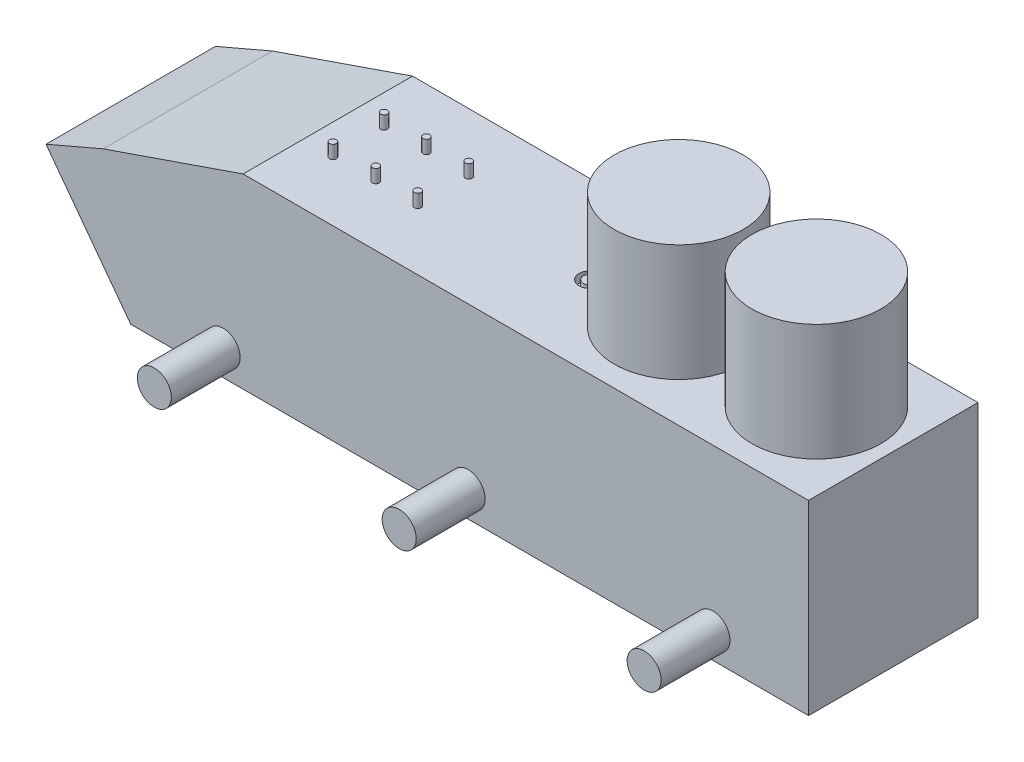
ISO-10303-21;
HEADER;
FILE_DESCRIPTION(('STEP AP214'),'2;1');
FILE_NAME('part.step','',(''),(''),'','','');
FILE_SCHEMA(('AUTOMOTIVE_DESIGN { 1 0 10303 214 1 1 1 1 }'));
ENDSEC;
DATA;
#1=APPLICATION_CONTEXT('core data for automotive mechanical design processes');
#2=APPLICATION_PROTOCOL_DEFINITION('international standard','automotive_design',2000,#1);
#3=PRODUCT_CONTEXT('',#1,'mechanical');
#4=PRODUCT('Part','Part','',(#3));
#5=PRODUCT_RELATED_PRODUCT_CATEGORY('part','',(#4));
#6=PRODUCT_DEFINITION_FORMATION('','',#4);
#7=PRODUCT_DEFINITION_CONTEXT('part definition',#1,'design');
#8=PRODUCT_DEFINITION('design','',#6,#7);
#9=PRODUCT_DEFINITION_SHAPE('','',#8);
#10=(LENGTH_UNIT() NAMED_UNIT(*) SI_UNIT(.MILLI.,.METRE.));
#11=(NAMED_UNIT(*) PLANE_ANGLE_UNIT() SI_UNIT($,.RADIAN.));
#12=(NAMED_UNIT(*) SI_UNIT($,.STERADIAN.) SOLID_ANGLE_UNIT());
#13=UNCERTAINTY_MEASURE_WITH_UNIT(LENGTH_MEASURE(1.E-05),#10,'distance_accuracy_value','');
#14=(GEOMETRIC_REPRESENTATION_CONTEXT(3) GLOBAL_UNCERTAINTY_ASSIGNED_CONTEXT((#13)) GLOBAL_UNIT_ASSIGNED_CONTEXT((#10,
#11,#12)) REPRESENTATION_CONTEXT('',''));
#15=CARTESIAN_POINT('',(0.,0.,0.));
#16=DIRECTION('',(0.,0.,1.));
#17=DIRECTION('',(1.,0.,0.));
#18=AXIS2_PLACEMENT_3D('',#15,#16,#17);
#19=CARTESIAN_POINT('',(1650.,290.827338129496,500.));
#20=DIRECTION('',(0.,-1.,0.));
#21=DIRECTION('',(1.,0.,0.));
#22=AXIS2_PLACEMENT_3D('',#19,#20,#21);
#23=PLANE('',#22);
#24=CARTESIAN_POINT('',(763.220602861019,290.827338129496,258.53961209144));
#25=DIRECTION('',(0.,1.,0.));
#26=DIRECTION('',(-1.,0.,0.));
#27=AXIS2_PLACEMENT_3D('',#24,#25,#26);
#28=CIRCLE('',#27,31.7499999999999);
#29=CARTESIAN_POINT('',(731.470602861019,290.827338129496,258.53961209144));
#30=VERTEX_POINT('',#29);
#31=EDGE_CURVE('E359',#30,#30,#28,.T.);
#32=ORIENTED_EDGE('',*,*,#31,.F.);
#33=EDGE_LOOP('',(#32));
#34=FACE_BOUND('',#33,.T.);
#35=CARTESIAN_POINT('',(1421.4,290.827338129496,248.149283126668));
#36=DIRECTION('',(0.,-1.,0.));
#37=DIRECTION('',(1.,0.,0.));
#38=AXIS2_PLACEMENT_3D('',#35,#36,#37);
#39=CIRCLE('',#38,190.5);
#40=CARTESIAN_POINT('',(1421.4,290.827338129496,57.6492831266675));
#41=VERTEX_POINT('',#40);
#42=EDGE_CURVE('E11',#41,#41,#39,.F.);
#43=ORIENTED_EDGE('',*,*,#42,.F.);
#44=EDGE_LOOP('',(#43));
#45=FACE_BOUND('',#44,.T.);
#46=CARTESIAN_POINT('',(1015.,290.827338129496,248.149283126668));
#47=DIRECTION('',(0.,-1.,0.));
#48=DIRECTION('',(1.,0.,0.));
#49=AXIS2_PLACEMENT_3D('',#46,#47,#48);
#50=CIRCLE('',#49,190.5);
#51=CARTESIAN_POINT('',(1015.,290.827338129496,57.6492831266678));
#52=VERTEX_POINT('',#51);
#53=EDGE_CURVE('E42',#52,#52,#50,.F.);
#54=ORIENTED_EDGE('',*,*,#53,.F.);
#55=EDGE_LOOP('',(#54));
#56=FACE_BOUND('',#55,.T.);
#57=CARTESIAN_POINT('',(70.5935735585222,290.827338129496,323.788946961614));
#58=DIRECTION('',(0.,-1.,0.));
#59=DIRECTION('',(1.,0.,0.));
#60=AXIS2_PLACEMENT_3D('',#57,#58,#59);
#61=CIRCLE('',#60,10.);
#62=CARTESIAN_POINT('',(80.5935735585222,290.827338129496,323.788946961614));
#63=VERTEX_POINT('',#62);
#64=EDGE_CURVE('E158',#63,#63,#61,.T.);
#65=ORIENTED_EDGE('',*,*,#64,.T.);
#66=EDGE_LOOP('',(#65));
#67=FACE_BOUND('',#66,.T.);
#68=CARTESIAN_POINT('',(195.593573558522,290.827338129496,322.32623375142));
#69=DIRECTION('',(0.,-1.,0.));
#70=DIRECTION('',(1.,0.,0.));
#71=AXIS2_PLACEMENT_3D('',#68,#69,#70);
#72=CIRCLE('',#71,10.);
#73=CARTESIAN_POINT('',(205.593573558522,290.827338129496,322.32623375142));
#74=VERTEX_POINT('',#73);
#75=EDGE_CURVE('E154',#74,#74,#72,.F.);
#76=ORIENTED_EDGE('',*,*,#75,.F.);
#77=EDGE_LOOP('',(#76));
#78=FACE_BOUND('',#77,.T.);
#79=CARTESIAN_POINT('',(320.593573558522,290.827338129496,323.788946961614));
#80=DIRECTION('',(0.,-1.,0.));
#81=DIRECTION('',(1.,0.,0.));
#82=AXIS2_PLACEMENT_3D('',#79,#80,#81);
#83=CIRCLE('',#82,9.99999999999998);
#84=CARTESIAN_POINT('',(330.593573558522,290.827338129496,323.788946961614));
#85=VERTEX_POINT('',#84);
#86=EDGE_CURVE('E143',#85,#85,#83,.F.);
#87=ORIENTED_EDGE('',*,*,#86,.F.);
#88=EDGE_LOOP('',(#87));
#89=FACE_BOUND('',#88,.T.);
#90=CARTESIAN_POINT('',(320.593573558522,290.827338129496,173.12555336084));
#91=DIRECTION('',(0.,-1.,0.));
#92=DIRECTION('',(1.,0.,0.));
#93=AXIS2_PLACEMENT_3D('',#90,#91,#92);
#94=CIRCLE('',#93,9.99999999999998);
#95=CARTESIAN_POINT('',(330.593573558522,290.827338129496,173.12555336084));
#96=VERTEX_POINT('',#95);
#97=EDGE_CURVE('E148',#96,#96,#94,.T.);
#98=ORIENTED_EDGE('',*,*,#97,.T.);
#99=EDGE_LOOP('',(#98));
#100=FACE_BOUND('',#99,.T.);
#101=CARTESIAN_POINT('',(195.593573558522,290.827338129496,173.12555336084));
#102=DIRECTION('',(0.,-1.,0.));
#103=DIRECTION('',(1.,0.,0.));
#104=AXIS2_PLACEMENT_3D('',#101,#102,#103);
#105=CIRCLE('',#104,10.);
#106=CARTESIAN_POINT('',(205.593573558522,290.827338129496,173.12555336084));
#107=VERTEX_POINT('',#106);
#108=EDGE_CURVE('E144',#107,#107,#105,.T.);
#109=ORIENTED_EDGE('',*,*,#108,.T.);
#110=EDGE_LOOP('',(#109));
#111=FACE_BOUND('',#110,.T.);
#112=CARTESIAN_POINT('',(70.5935735585222,290.827338129496,173.12555336084));
#113=DIRECTION('',(0.,-1.,0.));
#114=DIRECTION('',(1.,0.,0.));
#115=AXIS2_PLACEMENT_3D('',#112,#113,#114);
#116=CIRCLE('',#115,10.);
#117=CARTESIAN_POINT('',(80.5935735585222,290.827338129496,173.12555336084));
#118=VERTEX_POINT('',#117);
#119=EDGE_CURVE('E140',#118,#118,#116,.F.);
#120=ORIENTED_EDGE('',*,*,#119,.F.);
#121=EDGE_LOOP('',(#120));
#122=FACE_BOUND('',#121,.T.);
#123=DIRECTION('',(0.,0.,-1.));
#124=VECTOR('',#123,1.);
#125=CARTESIAN_POINT('',(-18.4803499003083,290.827338129496,500.));
#126=LINE('',#125,#124);
#127=CARTESIAN_POINT('',(-18.4803499003079,290.827338129496,500.));
#128=VERTEX_POINT('',#127);
#129=CARTESIAN_POINT('',(-18.4803499003062,290.827338129497,0.));
#130=VERTEX_POINT('',#129);
#131=EDGE_CURVE('E49',#128,#130,#126,.T.);
#132=ORIENTED_EDGE('',*,*,#131,.F.);
#133=DIRECTION('',(-1.,0.,0.));
#134=VECTOR('',#133,1.);
#135=CARTESIAN_POINT('',(1650.,290.827338129496,500.));
#136=LINE('',#135,#134);
#137=CARTESIAN_POINT('',(1650.,290.827338129496,500.));
#138=VERTEX_POINT('',#137);
#139=EDGE_CURVE('E86',#138,#128,#136,.T.);
#140=ORIENTED_EDGE('',*,*,#139,.F.);
#141=DIRECTION('',(0.,0.,-1.));
#142=VECTOR('',#141,1.);
#143=CARTESIAN_POINT('',(1650.,290.827338129496,500.));
#144=LINE('',#143,#142);
#145=CARTESIAN_POINT('',(1650.,290.827338129496,0.));
#146=VERTEX_POINT('',#145);
#147=EDGE_CURVE('E137',#138,#146,#144,.T.);
#148=ORIENTED_EDGE('',*,*,#147,.T.);
#149=DIRECTION('',(-1.,0.,0.));
#150=VECTOR('',#149,1.);
#151=CARTESIAN_POINT('',(1650.,290.827338129496,0.));
#152=LINE('',#151,#150);
#153=EDGE_CURVE('E125',#146,#130,#152,.T.);
#154=ORIENTED_EDGE('',*,*,#153,.T.);
#155=EDGE_LOOP('',(#132,#140,#148,#154));
#156=FACE_BOUND('',#155,.T.);
#157=ADVANCED_FACE('F34',(#34,#45,#56,#67,#78,#89,#100,#111,#122,#156),#23,.F.);
#158=CARTESIAN_POINT('',(-600.,76.0791366906475,500.));
#159=DIRECTION('',(0.394637197892977,-0.918837026919997,0.));
#160=DIRECTION('',(0.918837026919997,0.394637197892977,0.));
#161=AXIS2_PLACEMENT_3D('',#158,#159,#160);
#162=PLANE('',#161);
#163=DIRECTION('',(0.,0.,1.));
#164=VECTOR('',#163,1.);
#165=CARTESIAN_POINT('',(-431.441514428658,148.474399918051,500.));
#166=LINE('',#165,#164);
#167=CARTESIAN_POINT('',(-431.44151442866,148.47439991805,0.));
#168=VERTEX_POINT('',#167);
#169=CARTESIAN_POINT('',(-431.44151442866,148.47439991805,500.));
#170=VERTEX_POINT('',#169);
#171=EDGE_CURVE('E95',#168,#170,#166,.T.);
#172=ORIENTED_EDGE('',*,*,#171,.F.);
#173=DIRECTION('',(-0.918837026919997,-0.394637197892977,0.));
#174=VECTOR('',#173,1.);
#175=CARTESIAN_POINT('',(-600.,76.0791366906475,0.));
#176=LINE('',#175,#174);
#177=CARTESIAN_POINT('',(-600.,76.0791366906475,0.));
#178=VERTEX_POINT('',#177);
#179=EDGE_CURVE('E128',#168,#178,#176,.T.);
#180=ORIENTED_EDGE('',*,*,#179,.T.);
#181=DIRECTION('',(0.,0.,-1.));
#182=VECTOR('',#181,1.);
#183=CARTESIAN_POINT('',(-600.,76.0791366906475,500.));
#184=LINE('',#183,#182);
#185=CARTESIAN_POINT('',(-600.,76.0791366906475,500.));
#186=VERTEX_POINT('',#185);
#187=EDGE_CURVE('E111',#186,#178,#184,.T.);
#188=ORIENTED_EDGE('',*,*,#187,.F.);
#189=DIRECTION('',(-0.918837026919997,-0.394637197892977,0.));
#190=VECTOR('',#189,1.);
#191=CARTESIAN_POINT('',(-600.,76.0791366906475,500.));
#192=LINE('',#191,#190);
#193=EDGE_CURVE('E105',#170,#186,#192,.T.);
#194=ORIENTED_EDGE('',*,*,#193,.F.);
#195=EDGE_LOOP('',(#172,#180,#188,#194));
#196=FACE_BOUND('',#195,.T.);
#197=ADVANCED_FACE('F109',(#196),#162,.F.);
#198=CARTESIAN_POINT('',(0.,0.,500.));
#199=DIRECTION('',(0.,0.,1.));
#200=DIRECTION('',(1.,0.,0.));
#201=AXIS2_PLACEMENT_3D('',#198,#199,#200);
#202=PLANE('',#201);
#203=CARTESIAN_POINT('',(645.43,-182.972661870504,500.));
#204=DIRECTION('',(0.,0.,1.));
#205=DIRECTION('',(1.,0.,0.));
#206=AXIS2_PLACEMENT_3D('',#203,#204,#205);
#207=CIRCLE('',#206,50.292);
#208=CARTESIAN_POINT('',(695.722,-182.972661870504,500.));
#209=VERTEX_POINT('',#208);
#210=EDGE_CURVE('E376',#209,#209,#207,.T.);
#211=ORIENTED_EDGE('',*,*,#210,.F.);
#212=EDGE_LOOP('',(#211));
#213=FACE_BOUND('',#212,.T.);
#214=CARTESIAN_POINT('',(-77.2000000000002,-182.972661870504,500.));
#215=DIRECTION('',(0.,0.,1.));
#216=DIRECTION('',(1.,0.,0.));
#217=AXIS2_PLACEMENT_3D('',#214,#215,#216);
#218=CIRCLE('',#217,50.165);
#219=CARTESIAN_POINT('',(-27.0350000000002,-182.972661870504,500.));
#220=VERTEX_POINT('',#219);
#221=EDGE_CURVE('E380',#220,#220,#218,.T.);
#222=ORIENTED_EDGE('',*,*,#221,.F.);
#223=EDGE_LOOP('',(#222));
#224=FACE_BOUND('',#223,.T.);
#225=CARTESIAN_POINT('',(1368.06,-182.972661870504,500.));
#226=DIRECTION('',(0.,0.,1.));
#227=DIRECTION('',(1.,0.,0.));
#228=AXIS2_PLACEMENT_3D('',#225,#226,#227);
#229=CIRCLE('',#228,50.165);
#230=CARTESIAN_POINT('',(1418.225,-182.972661870504,500.));
#231=VERTEX_POINT('',#230);
#232=EDGE_CURVE('E386',#231,#231,#229,.T.);
#233=ORIENTED_EDGE('',*,*,#232,.F.);
#234=EDGE_LOOP('',(#233));
#235=FACE_BOUND('',#234,.T.);
#236=ORIENTED_EDGE('',*,*,#139,.T.);
#237=DIRECTION('',(0.945406463628837,0.32589356932719,0.));
#238=VECTOR('',#237,1.);
#239=CARTESIAN_POINT('',(-629.160159727757,80.318281340511,500.));
#240=LINE('',#239,#238);
#241=EDGE_CURVE('E98',#170,#128,#240,.T.);
#242=ORIENTED_EDGE('',*,*,#241,.F.);
#243=ORIENTED_EDGE('',*,*,#193,.T.);
#244=DIRECTION('',(0.597795774435643,-0.801648434207222,0.));
#245=VECTOR('',#244,1.);
#246=CARTESIAN_POINT('',(-600.,76.0791366906475,500.));
#247=LINE('',#246,#245);
#248=CARTESIAN_POINT('',(-350.,-259.172661870504,500.));
#249=VERTEX_POINT('',#248);
#250=EDGE_CURVE('E113',#186,#249,#247,.T.);
#251=ORIENTED_EDGE('',*,*,#250,.T.);
#252=DIRECTION('',(1.,0.,0.));
#253=VECTOR('',#252,1.);
#254=CARTESIAN_POINT('',(1650.,-259.172661870504,500.));
#255=LINE('',#254,#253);
#256=CARTESIAN_POINT('',(1650.,-259.172661870504,500.));
#257=VERTEX_POINT('',#256);
#258=EDGE_CURVE('E58',#249,#257,#255,.T.);
#259=ORIENTED_EDGE('',*,*,#258,.T.);
#260=DIRECTION('',(0.,1.,0.));
#261=VECTOR('',#260,1.);
#262=CARTESIAN_POINT('',(1650.,-259.172661870504,500.));
#263=LINE('',#262,#261);
#264=EDGE_CURVE('E116',#257,#138,#263,.T.);
#265=ORIENTED_EDGE('',*,*,#264,.T.);
#266=EDGE_LOOP('',(#236,#242,#243,#251,#259,#265));
#267=FACE_BOUND('',#266,.T.);
#268=ADVANCED_FACE('F104',(#213,#224,#235,#267),#202,.T.);
#269=CARTESIAN_POINT('',(0.,0.,0.));
#270=DIRECTION('',(0.,0.,1.));
#271=DIRECTION('',(1.,0.,0.));
#272=AXIS2_PLACEMENT_3D('',#269,#270,#271);
#273=PLANE('',#272);
#274=CARTESIAN_POINT('',(622.57,-182.972661870504,0.));
#275=DIRECTION('',(0.,0.,1.));
#276=DIRECTION('',(1.,0.,0.));
#277=AXIS2_PLACEMENT_3D('',#274,#275,#276);
#278=CIRCLE('',#277,50.1650000000001);
#279=CARTESIAN_POINT('',(672.735,-182.972661870504,0.));
#280=VERTEX_POINT('',#279);
#281=EDGE_CURVE('E168',#280,#280,#278,.F.);
#282=ORIENTED_EDGE('',*,*,#281,.F.);
#283=EDGE_LOOP('',(#282));
#284=FACE_BOUND('',#283,.T.);
#285=CARTESIAN_POINT('',(-77.1999999999999,-182.972661870504,0.));
#286=DIRECTION('',(0.,0.,1.));
#287=DIRECTION('',(1.,0.,0.));
#288=AXIS2_PLACEMENT_3D('',#285,#286,#287);
#289=CIRCLE('',#288,50.1649999999999);
#290=CARTESIAN_POINT('',(-27.035,-182.972661870504,0.));
#291=VERTEX_POINT('',#290);
#292=EDGE_CURVE('E165',#291,#291,#289,.F.);
#293=ORIENTED_EDGE('',*,*,#292,.F.);
#294=EDGE_LOOP('',(#293));
#295=FACE_BOUND('',#294,.T.);
#296=CARTESIAN_POINT('',(1345.2,-182.972661870504,0.));
#297=DIRECTION('',(0.,0.,1.));
#298=DIRECTION('',(1.,0.,0.));
#299=AXIS2_PLACEMENT_3D('',#296,#297,#298);
#300=CIRCLE('',#299,50.165);
#301=CARTESIAN_POINT('',(1395.365,-182.972661870504,0.));
#302=VERTEX_POINT('',#301);
#303=EDGE_CURVE('E157',#302,#302,#300,.F.);
#304=ORIENTED_EDGE('',*,*,#303,.F.);
#305=EDGE_LOOP('',(#304));
#306=FACE_BOUND('',#305,.T.);
#307=DIRECTION('',(-0.945406463628837,-0.32589356932719,0.));
#308=VECTOR('',#307,1.);
#309=CARTESIAN_POINT('',(-91.5671871110701,265.633380645828,0.));
#310=LINE('',#309,#308);
#311=EDGE_CURVE('E99',#130,#168,#310,.T.);
#312=ORIENTED_EDGE('',*,*,#311,.F.);
#313=ORIENTED_EDGE('',*,*,#153,.F.);
#314=DIRECTION('',(0.,1.,0.));
#315=VECTOR('',#314,1.);
#316=CARTESIAN_POINT('',(1650.,-259.172661870504,0.));
#317=LINE('',#316,#315);
#318=CARTESIAN_POINT('',(1650.,-259.172661870504,0.));
#319=VERTEX_POINT('',#318);
#320=EDGE_CURVE('E122',#319,#146,#317,.T.);
#321=ORIENTED_EDGE('',*,*,#320,.F.);
#322=DIRECTION('',(1.,0.,0.));
#323=VECTOR('',#322,1.);
#324=CARTESIAN_POINT('',(1650.,-259.172661870504,0.));
#325=LINE('',#324,#323);
#326=CARTESIAN_POINT('',(-350.,-259.172661870504,0.));
#327=VERTEX_POINT('',#326);
#328=EDGE_CURVE('E79',#327,#319,#325,.T.);
#329=ORIENTED_EDGE('',*,*,#328,.F.);
#330=DIRECTION('',(0.597795774435643,-0.801648434207222,0.));
#331=VECTOR('',#330,1.);
#332=CARTESIAN_POINT('',(-600.,76.0791366906475,0.));
#333=LINE('',#332,#331);
#334=EDGE_CURVE('E130',#178,#327,#333,.T.);
#335=ORIENTED_EDGE('',*,*,#334,.F.);
#336=ORIENTED_EDGE('',*,*,#179,.F.);
#337=EDGE_LOOP('',(#312,#313,#321,#329,#335,#336));
#338=FACE_BOUND('',#337,.T.);
#339=ADVANCED_FACE('F196',(#284,#295,#306,#338),#273,.F.);
#340=CARTESIAN_POINT('',(1650.,-259.172661870504,500.));
#341=DIRECTION('',(-1.,0.,0.));
#342=DIRECTION('',(0.,0.,1.));
#343=AXIS2_PLACEMENT_3D('',#340,#341,#342);
#344=PLANE('',#343);
#345=ORIENTED_EDGE('',*,*,#320,.T.);
#346=ORIENTED_EDGE('',*,*,#147,.F.);
#347=ORIENTED_EDGE('',*,*,#264,.F.);
#348=DIRECTION('',(0.,0.,-1.));
#349=VECTOR('',#348,1.);
#350=CARTESIAN_POINT('',(1650.,-259.172661870504,500.));
#351=LINE('',#350,#349);
#352=EDGE_CURVE('E121',#257,#319,#351,.T.);
#353=ORIENTED_EDGE('',*,*,#352,.T.);
#354=EDGE_LOOP('',(#345,#346,#347,#353));
#355=FACE_BOUND('',#354,.T.);
#356=ADVANCED_FACE('F36',(#355),#344,.F.);
#357=CARTESIAN_POINT('',(-600.,76.0791366906475,500.));
#358=DIRECTION('',(0.801648434207222,0.597795774435643,0.));
#359=DIRECTION('',(-0.597795774435643,0.801648434207222,0.));
#360=AXIS2_PLACEMENT_3D('',#357,#358,#359);
#361=PLANE('',#360);
#362=ORIENTED_EDGE('',*,*,#334,.T.);
#363=DIRECTION('',(0.,0.,-1.));
#364=VECTOR('',#363,1.);
#365=CARTESIAN_POINT('',(-350.,-259.172661870504,500.));
#366=LINE('',#365,#364);
#367=EDGE_CURVE('E134',#249,#327,#366,.T.);
#368=ORIENTED_EDGE('',*,*,#367,.F.);
#369=ORIENTED_EDGE('',*,*,#250,.F.);
#370=ORIENTED_EDGE('',*,*,#187,.T.);
#371=EDGE_LOOP('',(#362,#368,#369,#370));
#372=FACE_BOUND('',#371,.T.);
#373=ADVANCED_FACE('F199',(#372),#361,.F.);
#374=CARTESIAN_POINT('',(1650.,-259.172661870504,500.));
#375=DIRECTION('',(0.,1.,0.));
#376=DIRECTION('',(-1.,0.,0.));
#377=AXIS2_PLACEMENT_3D('',#374,#375,#376);
#378=PLANE('',#377);
#379=ORIENTED_EDGE('',*,*,#328,.T.);
#380=ORIENTED_EDGE('',*,*,#352,.F.);
#381=ORIENTED_EDGE('',*,*,#258,.F.);
#382=ORIENTED_EDGE('',*,*,#367,.T.);
#383=EDGE_LOOP('',(#379,#380,#381,#382));
#384=FACE_BOUND('',#383,.T.);
#385=ADVANCED_FACE('F201',(#384),#378,.F.);
#386=CARTESIAN_POINT('',(-629.160159727757,80.318281340511,500.));
#387=DIRECTION('',(-0.32589356932719,0.945406463628837,0.));
#388=DIRECTION('',(-0.945406463628837,-0.32589356932719,0.));
#389=AXIS2_PLACEMENT_3D('',#386,#387,#388);
#390=PLANE('',#389);
#391=ORIENTED_EDGE('',*,*,#131,.T.);
#392=ORIENTED_EDGE('',*,*,#311,.T.);
#393=ORIENTED_EDGE('',*,*,#171,.T.);
#394=ORIENTED_EDGE('',*,*,#241,.T.);
#395=EDGE_LOOP('',(#391,#392,#393,#394));
#396=FACE_BOUND('',#395,.T.);
#397=ADVANCED_FACE('F97',(#396),#390,.T.);
#398=CARTESIAN_POINT('',(70.5935735585222,330.,173.12555336084));
#399=DIRECTION('',(0.,-1.,0.));
#400=DIRECTION('',(0.,0.,-1.));
#401=AXIS2_PLACEMENT_3D('',#398,#399,#400);
#402=CYLINDRICAL_SURFACE('',#401,10.);
#403=CARTESIAN_POINT('',(70.5935735585222,330.,173.12555336084));
#404=DIRECTION('',(0.,1.,0.));
#405=DIRECTION('',(0.,0.,1.));
#406=AXIS2_PLACEMENT_3D('',#403,#404,#405);
#407=CIRCLE('',#406,10.);
#408=CARTESIAN_POINT('',(70.5935735585222,330.,183.12555336084));
#409=VERTEX_POINT('',#408);
#410=EDGE_CURVE('E107',#409,#409,#407,.T.);
#411=ORIENTED_EDGE('',*,*,#410,.F.);
#412=EDGE_LOOP('',(#411));
#413=FACE_BOUND('',#412,.T.);
#414=ORIENTED_EDGE('',*,*,#119,.T.);
#415=EDGE_LOOP('',(#414));
#416=FACE_BOUND('',#415,.T.);
#417=ADVANCED_FACE('F208',(#413,#416),#402,.T.);
#418=CARTESIAN_POINT('',(70.5935735585222,330.,173.12555336084));
#419=DIRECTION('',(0.,1.,0.));
#420=DIRECTION('',(0.,0.,1.));
#421=AXIS2_PLACEMENT_3D('',#418,#419,#420);
#422=PLANE('',#421);
#423=ORIENTED_EDGE('',*,*,#410,.T.);
#424=EDGE_LOOP('',(#423));
#425=FACE_BOUND('',#424,.T.);
#426=ADVANCED_FACE('F228',(#425),#422,.T.);
#427=CARTESIAN_POINT('',(195.593573558522,330.,173.12555336084));
#428=DIRECTION('',(0.,-1.,0.));
#429=DIRECTION('',(0.,0.,-1.));
#430=AXIS2_PLACEMENT_3D('',#427,#428,#429);
#431=CYLINDRICAL_SURFACE('',#430,10.);
#432=CARTESIAN_POINT('',(195.593573558522,330.,173.12555336084));
#433=DIRECTION('',(0.,-1.,0.));
#434=DIRECTION('',(0.,0.,-1.));
#435=AXIS2_PLACEMENT_3D('',#432,#433,#434);
#436=CIRCLE('',#435,10.);
#437=CARTESIAN_POINT('',(195.593573558522,330.,163.12555336084));
#438=VERTEX_POINT('',#437);
#439=EDGE_CURVE('E147',#438,#438,#436,.T.);
#440=ORIENTED_EDGE('',*,*,#439,.T.);
#441=EDGE_LOOP('',(#440));
#442=FACE_BOUND('',#441,.T.);
#443=ORIENTED_EDGE('',*,*,#108,.F.);
#444=EDGE_LOOP('',(#443));
#445=FACE_BOUND('',#444,.T.);
#446=ADVANCED_FACE('F232',(#442,#445),#431,.T.);
#447=CARTESIAN_POINT('',(195.593573558522,330.,173.12555336084));
#448=DIRECTION('',(0.,-1.,0.));
#449=DIRECTION('',(0.,0.,-1.));
#450=AXIS2_PLACEMENT_3D('',#447,#448,#449);
#451=PLANE('',#450);
#452=ORIENTED_EDGE('',*,*,#439,.F.);
#453=EDGE_LOOP('',(#452));
#454=FACE_BOUND('',#453,.T.);
#455=ADVANCED_FACE('F234',(#454),#451,.F.);
#456=CARTESIAN_POINT('',(320.593573558522,330.,173.12555336084));
#457=DIRECTION('',(0.,-1.,0.));
#458=DIRECTION('',(0.,0.,-1.));
#459=AXIS2_PLACEMENT_3D('',#456,#457,#458);
#460=CYLINDRICAL_SURFACE('',#459,9.99999999999998);
#461=CARTESIAN_POINT('',(320.593573558522,330.,173.12555336084));
#462=DIRECTION('',(0.,-1.,0.));
#463=DIRECTION('',(0.,0.,-1.));
#464=AXIS2_PLACEMENT_3D('',#461,#462,#463);
#465=CIRCLE('',#464,9.99999999999998);
#466=CARTESIAN_POINT('',(320.593573558522,330.,163.12555336084));
#467=VERTEX_POINT('',#466);
#468=EDGE_CURVE('E151',#467,#467,#465,.T.);
#469=ORIENTED_EDGE('',*,*,#468,.T.);
#470=EDGE_LOOP('',(#469));
#471=FACE_BOUND('',#470,.T.);
#472=ORIENTED_EDGE('',*,*,#97,.F.);
#473=EDGE_LOOP('',(#472));
#474=FACE_BOUND('',#473,.T.);
#475=ADVANCED_FACE('F237',(#471,#474),#460,.T.);
#476=CARTESIAN_POINT('',(320.593573558522,330.,173.12555336084));
#477=DIRECTION('',(0.,-1.,0.));
#478=DIRECTION('',(0.,0.,-1.));
#479=AXIS2_PLACEMENT_3D('',#476,#477,#478);
#480=PLANE('',#479);
#481=ORIENTED_EDGE('',*,*,#468,.F.);
#482=EDGE_LOOP('',(#481));
#483=FACE_BOUND('',#482,.T.);
#484=ADVANCED_FACE('F242',(#483),#480,.F.);
#485=CARTESIAN_POINT('',(320.593573558522,330.,323.788946961614));
#486=DIRECTION('',(0.,-1.,0.));
#487=DIRECTION('',(0.,0.,-1.));
#488=AXIS2_PLACEMENT_3D('',#485,#486,#487);
#489=CYLINDRICAL_SURFACE('',#488,9.99999999999998);
#490=CARTESIAN_POINT('',(320.593573558522,330.,323.788946961614));
#491=DIRECTION('',(0.,1.,0.));
#492=DIRECTION('',(0.,0.,1.));
#493=AXIS2_PLACEMENT_3D('',#490,#491,#492);
#494=CIRCLE('',#493,9.99999999999998);
#495=CARTESIAN_POINT('',(320.593573558522,330.,333.788946961614));
#496=VERTEX_POINT('',#495);
#497=EDGE_CURVE('E404',#496,#496,#494,.T.);
#498=ORIENTED_EDGE('',*,*,#497,.F.);
#499=EDGE_LOOP('',(#498));
#500=FACE_BOUND('',#499,.T.);
#501=ORIENTED_EDGE('',*,*,#86,.T.);
#502=EDGE_LOOP('',(#501));
#503=FACE_BOUND('',#502,.T.);
#504=ADVANCED_FACE('F245',(#500,#503),#489,.T.);
#505=CARTESIAN_POINT('',(320.593573558522,330.,323.788946961614));
#506=DIRECTION('',(0.,1.,0.));
#507=DIRECTION('',(0.,0.,1.));
#508=AXIS2_PLACEMENT_3D('',#505,#506,#507);
#509=PLANE('',#508);
#510=ORIENTED_EDGE('',*,*,#497,.T.);
#511=EDGE_LOOP('',(#510));
#512=FACE_BOUND('',#511,.T.);
#513=ADVANCED_FACE('F250',(#512),#509,.T.);
#514=CARTESIAN_POINT('',(195.593573558522,330.,322.32623375142));
#515=DIRECTION('',(0.,-1.,0.));
#516=DIRECTION('',(0.,0.,-1.));
#517=AXIS2_PLACEMENT_3D('',#514,#515,#516);
#518=CYLINDRICAL_SURFACE('',#517,10.);
#519=CARTESIAN_POINT('',(195.593573558522,330.,322.32623375142));
#520=DIRECTION('',(0.,1.,0.));
#521=DIRECTION('',(0.,0.,1.));
#522=AXIS2_PLACEMENT_3D('',#519,#520,#521);
#523=CIRCLE('',#522,10.);
#524=CARTESIAN_POINT('',(195.593573558522,330.,332.32623375142));
#525=VERTEX_POINT('',#524);
#526=EDGE_CURVE('E161',#525,#525,#523,.T.);
#527=ORIENTED_EDGE('',*,*,#526,.F.);
#528=EDGE_LOOP('',(#527));
#529=FACE_BOUND('',#528,.T.);
#530=ORIENTED_EDGE('',*,*,#75,.T.);
#531=EDGE_LOOP('',(#530));
#532=FACE_BOUND('',#531,.T.);
#533=ADVANCED_FACE('F253',(#529,#532),#518,.T.);
#534=CARTESIAN_POINT('',(195.593573558522,330.,322.32623375142));
#535=DIRECTION('',(0.,1.,0.));
#536=DIRECTION('',(0.,0.,1.));
#537=AXIS2_PLACEMENT_3D('',#534,#535,#536);
#538=PLANE('',#537);
#539=ORIENTED_EDGE('',*,*,#526,.T.);
#540=EDGE_LOOP('',(#539));
#541=FACE_BOUND('',#540,.T.);
#542=ADVANCED_FACE('F258',(#541),#538,.T.);
#543=CARTESIAN_POINT('',(70.5935735585222,330.,323.788946961614));
#544=DIRECTION('',(0.,-1.,0.));
#545=DIRECTION('',(0.,0.,-1.));
#546=AXIS2_PLACEMENT_3D('',#543,#544,#545);
#547=CYLINDRICAL_SURFACE('',#546,10.);
#548=CARTESIAN_POINT('',(70.5935735585222,330.,323.788946961614));
#549=DIRECTION('',(0.,-1.,0.));
#550=DIRECTION('',(0.,0.,-1.));
#551=AXIS2_PLACEMENT_3D('',#548,#549,#550);
#552=CIRCLE('',#551,10.);
#553=CARTESIAN_POINT('',(70.5935735585222,330.,313.788946961614));
#554=VERTEX_POINT('',#553);
#555=EDGE_CURVE('E162',#554,#554,#552,.T.);
#556=ORIENTED_EDGE('',*,*,#555,.T.);
#557=EDGE_LOOP('',(#556));
#558=FACE_BOUND('',#557,.T.);
#559=ORIENTED_EDGE('',*,*,#64,.F.);
#560=EDGE_LOOP('',(#559));
#561=FACE_BOUND('',#560,.T.);
#562=ADVANCED_FACE('F261',(#558,#561),#547,.T.);
#563=CARTESIAN_POINT('',(70.5935735585222,330.,323.788946961614));
#564=DIRECTION('',(0.,-1.,0.));
#565=DIRECTION('',(0.,0.,-1.));
#566=AXIS2_PLACEMENT_3D('',#563,#564,#565);
#567=PLANE('',#566);
#568=ORIENTED_EDGE('',*,*,#555,.F.);
#569=EDGE_LOOP('',(#568));
#570=FACE_BOUND('',#569,.T.);
#571=ADVANCED_FACE('F266',(#570),#567,.F.);
#572=CARTESIAN_POINT('',(1345.2,-182.972661870504,-203.2));
#573=DIRECTION('',(0.,0.,1.));
#574=DIRECTION('',(1.,0.,0.));
#575=AXIS2_PLACEMENT_3D('',#572,#573,#574);
#576=CYLINDRICAL_SURFACE('',#575,50.165);
#577=CARTESIAN_POINT('',(1345.2,-182.972661870504,-203.2));
#578=DIRECTION('',(0.,0.,-1.));
#579=DIRECTION('',(-1.,0.,0.));
#580=AXIS2_PLACEMENT_3D('',#577,#578,#579);
#581=CIRCLE('',#580,50.165);
#582=CARTESIAN_POINT('',(1295.035,-182.972661870504,-203.2));
#583=VERTEX_POINT('',#582);
#584=EDGE_CURVE('E397',#583,#583,#581,.T.);
#585=ORIENTED_EDGE('',*,*,#584,.F.);
#586=EDGE_LOOP('',(#585));
#587=FACE_BOUND('',#586,.T.);
#588=ORIENTED_EDGE('',*,*,#303,.T.);
#589=EDGE_LOOP('',(#588));
#590=FACE_BOUND('',#589,.T.);
#591=ADVANCED_FACE('F269',(#587,#590),#576,.T.);
#592=CARTESIAN_POINT('',(1345.2,-182.972661870504,-203.2));
#593=DIRECTION('',(0.,0.,-1.));
#594=DIRECTION('',(-1.,0.,0.));
#595=AXIS2_PLACEMENT_3D('',#592,#593,#594);
#596=PLANE('',#595);
#597=ORIENTED_EDGE('',*,*,#584,.T.);
#598=EDGE_LOOP('',(#597));
#599=FACE_BOUND('',#598,.T.);
#600=ADVANCED_FACE('F276',(#599),#596,.T.);
#601=CARTESIAN_POINT('',(-77.1999999999999,-182.972661870504,-203.2));
#602=DIRECTION('',(0.,0.,1.));
#603=DIRECTION('',(1.,0.,0.));
#604=AXIS2_PLACEMENT_3D('',#601,#602,#603);
#605=CYLINDRICAL_SURFACE('',#604,50.1649999999999);
#606=CARTESIAN_POINT('',(-77.1999999999999,-182.972661870504,-203.2));
#607=DIRECTION('',(0.,0.,-1.));
#608=DIRECTION('',(-1.,0.,0.));
#609=AXIS2_PLACEMENT_3D('',#606,#607,#608);
#610=CIRCLE('',#609,50.1649999999999);
#611=CARTESIAN_POINT('',(-127.365,-182.972661870504,-203.2));
#612=VERTEX_POINT('',#611);
#613=EDGE_CURVE('E392',#612,#612,#610,.T.);
#614=ORIENTED_EDGE('',*,*,#613,.F.);
#615=EDGE_LOOP('',(#614));
#616=FACE_BOUND('',#615,.T.);
#617=ORIENTED_EDGE('',*,*,#292,.T.);
#618=EDGE_LOOP('',(#617));
#619=FACE_BOUND('',#618,.T.);
#620=ADVANCED_FACE('F280',(#616,#619),#605,.T.);
#621=CARTESIAN_POINT('',(-77.1999999999999,-182.972661870504,-203.2));
#622=DIRECTION('',(0.,0.,-1.));
#623=DIRECTION('',(-1.,0.,0.));
#624=AXIS2_PLACEMENT_3D('',#621,#622,#623);
#625=PLANE('',#624);
#626=ORIENTED_EDGE('',*,*,#613,.T.);
#627=EDGE_LOOP('',(#626));
#628=FACE_BOUND('',#627,.T.);
#629=ADVANCED_FACE('F284',(#628),#625,.T.);
#630=CARTESIAN_POINT('',(1368.06,-182.972661870504,703.2));
#631=DIRECTION('',(0.,0.,-1.));
#632=DIRECTION('',(-1.,0.,0.));
#633=AXIS2_PLACEMENT_3D('',#630,#631,#632);
#634=CYLINDRICAL_SURFACE('',#633,50.165);
#635=CARTESIAN_POINT('',(1368.06,-182.972661870504,703.2));
#636=DIRECTION('',(0.,0.,1.));
#637=DIRECTION('',(1.,0.,0.));
#638=AXIS2_PLACEMENT_3D('',#635,#636,#637);
#639=CIRCLE('',#638,50.165);
#640=CARTESIAN_POINT('',(1418.225,-182.972661870504,703.2));
#641=VERTEX_POINT('',#640);
#642=EDGE_CURVE('E389',#641,#641,#639,.T.);
#643=ORIENTED_EDGE('',*,*,#642,.F.);
#644=EDGE_LOOP('',(#643));
#645=FACE_BOUND('',#644,.T.);
#646=ORIENTED_EDGE('',*,*,#232,.T.);
#647=EDGE_LOOP('',(#646));
#648=FACE_BOUND('',#647,.T.);
#649=ADVANCED_FACE('F288',(#645,#648),#634,.T.);
#650=CARTESIAN_POINT('',(1368.06,-182.972661870504,703.2));
#651=DIRECTION('',(0.,0.,1.));
#652=DIRECTION('',(1.,0.,0.));
#653=AXIS2_PLACEMENT_3D('',#650,#651,#652);
#654=PLANE('',#653);
#655=ORIENTED_EDGE('',*,*,#642,.T.);
#656=EDGE_LOOP('',(#655));
#657=FACE_BOUND('',#656,.T.);
#658=ADVANCED_FACE('F292',(#657),#654,.T.);
#659=CARTESIAN_POINT('',(-77.2000000000002,-182.972661870504,703.2));
#660=DIRECTION('',(0.,0.,-1.));
#661=DIRECTION('',(-1.,0.,0.));
#662=AXIS2_PLACEMENT_3D('',#659,#660,#661);
#663=CYLINDRICAL_SURFACE('',#662,50.165);
#664=CARTESIAN_POINT('',(-77.2000000000002,-182.972661870504,703.2));
#665=DIRECTION('',(0.,0.,1.));
#666=DIRECTION('',(1.,0.,0.));
#667=AXIS2_PLACEMENT_3D('',#664,#665,#666);
#668=CIRCLE('',#667,50.165);
#669=CARTESIAN_POINT('',(-27.0350000000002,-182.972661870504,703.2));
#670=VERTEX_POINT('',#669);
#671=EDGE_CURVE('E383',#670,#670,#668,.T.);
#672=ORIENTED_EDGE('',*,*,#671,.F.);
#673=EDGE_LOOP('',(#672));
#674=FACE_BOUND('',#673,.T.);
#675=ORIENTED_EDGE('',*,*,#221,.T.);
#676=EDGE_LOOP('',(#675));
#677=FACE_BOUND('',#676,.T.);
#678=ADVANCED_FACE('F296',(#674,#677),#663,.T.);
#679=CARTESIAN_POINT('',(-77.2000000000002,-182.972661870504,703.2));
#680=DIRECTION('',(0.,0.,1.));
#681=DIRECTION('',(1.,0.,0.));
#682=AXIS2_PLACEMENT_3D('',#679,#680,#681);
#683=PLANE('',#682);
#684=ORIENTED_EDGE('',*,*,#671,.T.);
#685=EDGE_LOOP('',(#684));
#686=FACE_BOUND('',#685,.T.);
#687=ADVANCED_FACE('F300',(#686),#683,.T.);
#688=CARTESIAN_POINT('',(645.43,-182.972661870504,703.2));
#689=DIRECTION('',(0.,0.,-1.));
#690=DIRECTION('',(-1.,0.,0.));
#691=AXIS2_PLACEMENT_3D('',#688,#689,#690);
#692=CYLINDRICAL_SURFACE('',#691,50.292);
#693=CARTESIAN_POINT('',(645.43,-182.972661870504,703.2));
#694=DIRECTION('',(0.,0.,1.));
#695=DIRECTION('',(1.,0.,0.));
#696=AXIS2_PLACEMENT_3D('',#693,#694,#695);
#697=CIRCLE('',#696,50.292);
#698=CARTESIAN_POINT('',(695.722,-182.972661870504,703.2));
#699=VERTEX_POINT('',#698);
#700=EDGE_CURVE('E377',#699,#699,#697,.T.);
#701=ORIENTED_EDGE('',*,*,#700,.F.);
#702=EDGE_LOOP('',(#701));
#703=FACE_BOUND('',#702,.T.);
#704=ORIENTED_EDGE('',*,*,#210,.T.);
#705=EDGE_LOOP('',(#704));
#706=FACE_BOUND('',#705,.T.);
#707=ADVANCED_FACE('F304',(#703,#706),#692,.T.);
#708=CARTESIAN_POINT('',(645.43,-182.972661870504,703.2));
#709=DIRECTION('',(0.,0.,1.));
#710=DIRECTION('',(1.,0.,0.));
#711=AXIS2_PLACEMENT_3D('',#708,#709,#710);
#712=PLANE('',#711);
#713=ORIENTED_EDGE('',*,*,#700,.T.);
#714=EDGE_LOOP('',(#713));
#715=FACE_BOUND('',#714,.T.);
#716=ADVANCED_FACE('F308',(#715),#712,.T.);
#717=CARTESIAN_POINT('',(622.57,-182.972661870504,-203.2));
#718=DIRECTION('',(0.,0.,1.));
#719=DIRECTION('',(1.,0.,0.));
#720=AXIS2_PLACEMENT_3D('',#717,#718,#719);
#721=CYLINDRICAL_SURFACE('',#720,50.1650000000001);
#722=CARTESIAN_POINT('',(622.57,-182.972661870504,-203.2));
#723=DIRECTION('',(0.,0.,-1.));
#724=DIRECTION('',(-1.,0.,0.));
#725=AXIS2_PLACEMENT_3D('',#722,#723,#724);
#726=CIRCLE('',#725,50.1650000000001);
#727=CARTESIAN_POINT('',(572.405,-182.972661870504,-203.2));
#728=VERTEX_POINT('',#727);
#729=EDGE_CURVE('E373',#728,#728,#726,.T.);
#730=ORIENTED_EDGE('',*,*,#729,.F.);
#731=EDGE_LOOP('',(#730));
#732=FACE_BOUND('',#731,.T.);
#733=ORIENTED_EDGE('',*,*,#281,.T.);
#734=EDGE_LOOP('',(#733));
#735=FACE_BOUND('',#734,.T.);
#736=ADVANCED_FACE('F312',(#732,#735),#721,.T.);
#737=CARTESIAN_POINT('',(622.57,-182.972661870504,-203.2));
#738=DIRECTION('',(0.,0.,-1.));
#739=DIRECTION('',(-1.,0.,0.));
#740=AXIS2_PLACEMENT_3D('',#737,#738,#739);
#741=PLANE('',#740);
#742=ORIENTED_EDGE('',*,*,#729,.T.);
#743=EDGE_LOOP('',(#742));
#744=FACE_BOUND('',#743,.T.);
#745=ADVANCED_FACE('F316',(#744),#741,.T.);
#746=CARTESIAN_POINT('',(1015.,635.,248.149283126668));
#747=DIRECTION('',(0.,-1.,0.));
#748=DIRECTION('',(0.,0.,-1.));
#749=AXIS2_PLACEMENT_3D('',#746,#747,#748);
#750=CYLINDRICAL_SURFACE('',#749,190.5);
#751=CARTESIAN_POINT('',(1015.,635.,248.149283126668));
#752=DIRECTION('',(0.,1.,0.));
#753=DIRECTION('',(0.,0.,1.));
#754=AXIS2_PLACEMENT_3D('',#751,#752,#753);
#755=CIRCLE('',#754,190.5);
#756=CARTESIAN_POINT('',(1015.,635.,57.6492831266678));
#757=VERTEX_POINT('',#756);
#758=EDGE_CURVE('E370',#757,#757,#755,.T.);
#759=CARTESIAN_POINT('',(1015.,635.,57.6492831266678));
#760=CARTESIAN_POINT('',(1015.,631.414868105516,57.6492831266678));
#761=CARTESIAN_POINT('',(1015.,627.829736211031,57.6492831266678));
#762=CARTESIAN_POINT('',(1015.,620.659472422062,57.6492831266678));
#763=CARTESIAN_POINT('',(1015.,617.074340527578,57.6492831266678));
#764=CARTESIAN_POINT('',(1015.,609.904076738609,57.6492831266678));
#765=CARTESIAN_POINT('',(1015.,606.318944844125,57.6492831266678));
#766=CARTESIAN_POINT('',(1015.,599.148681055156,57.6492831266678));
#767=CARTESIAN_POINT('',(1015.,595.563549160671,57.6492831266678));
#768=CARTESIAN_POINT('',(1015.,588.393285371703,57.6492831266678));
#769=CARTESIAN_POINT('',(1015.,584.808153477218,57.6492831266678));
#770=CARTESIAN_POINT('',(1015.,577.637889688249,57.6492831266678));
#771=CARTESIAN_POINT('',(1015.,574.052757793765,57.6492831266678));
#772=CARTESIAN_POINT('',(1015.,566.882494004796,57.6492831266678));
#773=CARTESIAN_POINT('',(1015.,563.297362110312,57.6492831266678));
#774=CARTESIAN_POINT('',(1015.,556.127098321343,57.6492831266678));
#775=CARTESIAN_POINT('',(1015.,552.541966426858,57.6492831266678));
#776=CARTESIAN_POINT('',(1015.,545.37170263789,57.6492831266678));
#777=CARTESIAN_POINT('',(1015.,541.786570743405,57.6492831266678));
#778=CARTESIAN_POINT('',(1015.,534.616306954436,57.6492831266678));
#779=CARTESIAN_POINT('',(1015.,531.031175059952,57.6492831266678));
#780=CARTESIAN_POINT('',(1015.,523.860911270983,57.6492831266678));
#781=CARTESIAN_POINT('',(1015.,520.275779376499,57.6492831266678));
#782=CARTESIAN_POINT('',(1015.,513.10551558753,57.6492831266678));
#783=CARTESIAN_POINT('',(1015.,509.520383693046,57.6492831266678));
#784=CARTESIAN_POINT('',(1015.,502.350119904077,57.6492831266678));
#785=CARTESIAN_POINT('',(1015.,498.764988009592,57.6492831266678));
#786=CARTESIAN_POINT('',(1015.,491.594724220624,57.6492831266678));
#787=CARTESIAN_POINT('',(1015.,488.009592326139,57.6492831266678));
#788=CARTESIAN_POINT('',(1015.,480.83932853717,57.6492831266678));
#789=CARTESIAN_POINT('',(1015.,477.254196642686,57.6492831266678));
#790=CARTESIAN_POINT('',(1015.,470.083932853717,57.6492831266678));
#791=CARTESIAN_POINT('',(1015.,466.498800959233,57.6492831266678));
#792=CARTESIAN_POINT('',(1015.,459.328537170264,57.6492831266678));
#793=CARTESIAN_POINT('',(1015.,455.743405275779,57.6492831266678));
#794=CARTESIAN_POINT('',(1015.,448.573141486811,57.6492831266678));
#795=CARTESIAN_POINT('',(1015.,444.988009592326,57.6492831266678));
#796=CARTESIAN_POINT('',(1015.,437.817745803357,57.6492831266678));
#797=CARTESIAN_POINT('',(1015.,434.232613908873,57.6492831266678));
#798=CARTESIAN_POINT('',(1015.,427.062350119904,57.6492831266678));
#799=CARTESIAN_POINT('',(1015.,423.47721822542,57.6492831266678));
#800=CARTESIAN_POINT('',(1015.,416.306954436451,57.6492831266678));
#801=CARTESIAN_POINT('',(1015.,412.721822541966,57.6492831266678));
#802=CARTESIAN_POINT('',(1015.,405.551558752998,57.6492831266678));
#803=CARTESIAN_POINT('',(1015.,401.966426858513,57.6492831266678));
#804=CARTESIAN_POINT('',(1015.,394.796163069544,57.6492831266678));
#805=CARTESIAN_POINT('',(1015.,391.21103117506,57.6492831266678));
#806=CARTESIAN_POINT('',(1015.,384.040767386091,57.6492831266678));
#807=CARTESIAN_POINT('',(1015.,380.455635491607,57.6492831266678));
#808=CARTESIAN_POINT('',(1015.,373.285371702638,57.6492831266678));
#809=CARTESIAN_POINT('',(1015.,369.700239808153,57.6492831266678));
#810=CARTESIAN_POINT('',(1015.,362.529976019185,57.6492831266678));
#811=CARTESIAN_POINT('',(1015.,358.9448441247,57.6492831266678));
#812=CARTESIAN_POINT('',(1015.,351.774580335731,57.6492831266678));
#813=CARTESIAN_POINT('',(1015.,348.189448441247,57.6492831266678));
#814=CARTESIAN_POINT('',(1015.,341.019184652278,57.6492831266678));
#815=CARTESIAN_POINT('',(1015.,337.434052757794,57.6492831266678));
#816=CARTESIAN_POINT('',(1015.,330.263788968825,57.6492831266678));
#817=CARTESIAN_POINT('',(1015.,326.67865707434,57.6492831266678));
#818=CARTESIAN_POINT('',(1015.,319.508393285372,57.6492831266678));
#819=CARTESIAN_POINT('',(1015.,315.923261390887,57.6492831266678));
#820=CARTESIAN_POINT('',(1015.,308.752997601918,57.6492831266678));
#821=CARTESIAN_POINT('',(1015.,305.167865707434,57.6492831266678));
#822=CARTESIAN_POINT('',(1015.,297.997601918465,57.6492831266678));
#823=CARTESIAN_POINT('',(1015.,294.412470023981,57.6492831266678));
#824=CARTESIAN_POINT('',(1015.,290.827338129496,57.6492831266678));
#825=B_SPLINE_CURVE_WITH_KNOTS('',3,(#759,#760,#761,#762,#763,#764,#765,#766,#767,#768,#769,
#770,#771,#772,#773,#774,#775,#776,#777,#778,#779,#780,#781,#782,#783,#784,#785,#786,#787,#788,
#789,#790,#791,#792,#793,#794,#795,#796,#797,#798,#799,#800,#801,#802,#803,#804,#805,#806,#807,
#808,#809,#810,#811,#812,#813,#814,#815,#816,#817,#818,#819,#820,#821,#822,#823,#824),
.UNSPECIFIED.,.F.,.F.,(4,2,2,2,2,2,2,2,2,2,2,2,2,2,2,2,2,2,2,2,2,2,2,2,2,2,2,2,2,2,2,2,4),(0.,
10.7553956834532,21.5107913669064,32.2661870503597,43.0215827338128,53.7769784172661,
64.5323741007193,75.2877697841726,86.0431654676258,96.7985611510791,107.553956834532,
118.309352517986,129.064748201439,139.820143884892,150.575539568345,161.330935251798,
172.086330935252,182.841726618705,193.597122302158,204.352517985611,215.107913669065,
225.863309352518,236.618705035971,247.374100719424,258.129496402878,268.884892086331,
279.640287769784,290.395683453237,301.151079136691,311.906474820144,322.661870503597,
333.41726618705,344.172661870503),.UNSPECIFIED.);
#826=EDGE_CURVE('BSEAM173',#757,#52,#825,.T.);
#827=ORIENTED_EDGE('',*,*,#758,.F.);
#828=ORIENTED_EDGE('',*,*,#53,.T.);
#829=ORIENTED_EDGE('',*,*,#826,.T.);
#830=ORIENTED_EDGE('',*,*,#826,.F.);
#831=EDGE_LOOP('',(#827,#829,#828,#830));
#832=FACE_BOUND('',#831,.T.);
#833=ADVANCED_FACE('F173',(#832),#750,.T.);
#834=CARTESIAN_POINT('',(1015.,635.,248.149283126668));
#835=DIRECTION('',(0.,1.,0.));
#836=DIRECTION('',(0.,0.,1.));
#837=AXIS2_PLACEMENT_3D('',#834,#835,#836);
#838=PLANE('',#837);
#839=ORIENTED_EDGE('',*,*,#758,.T.);
#840=EDGE_LOOP('',(#839));
#841=FACE_BOUND('',#840,.T.);
#842=ADVANCED_FACE('F323',(#841),#838,.T.);
#843=CARTESIAN_POINT('',(1421.4,635.,248.149283126668));
#844=DIRECTION('',(0.,-1.,0.));
#845=DIRECTION('',(0.,0.,-1.));
#846=AXIS2_PLACEMENT_3D('',#843,#844,#845);
#847=CYLINDRICAL_SURFACE('',#846,190.5);
#848=CARTESIAN_POINT('',(1421.4,635.,248.149283126668));
#849=DIRECTION('',(0.,1.,0.));
#850=DIRECTION('',(0.,0.,1.));
#851=AXIS2_PLACEMENT_3D('',#848,#849,#850);
#852=CIRCLE('',#851,190.5);
#853=CARTESIAN_POINT('',(1421.4,635.,57.6492831266675));
#854=VERTEX_POINT('',#853);
#855=EDGE_CURVE('E365',#854,#854,#852,.T.);
#856=CARTESIAN_POINT('',(1421.4,635.,57.6492831266675));
#857=CARTESIAN_POINT('',(1421.4,631.414868105516,57.6492831266675));
#858=CARTESIAN_POINT('',(1421.4,627.829736211031,57.6492831266675));
#859=CARTESIAN_POINT('',(1421.4,620.659472422062,57.6492831266675));
#860=CARTESIAN_POINT('',(1421.4,617.074340527578,57.6492831266675));
#861=CARTESIAN_POINT('',(1421.4,609.904076738609,57.6492831266675));
#862=CARTESIAN_POINT('',(1421.4,606.318944844125,57.6492831266675));
#863=CARTESIAN_POINT('',(1421.4,599.148681055156,57.6492831266675));
#864=CARTESIAN_POINT('',(1421.4,595.563549160671,57.6492831266675));
#865=CARTESIAN_POINT('',(1421.4,588.393285371703,57.6492831266675));
#866=CARTESIAN_POINT('',(1421.4,584.808153477218,57.6492831266675));
#867=CARTESIAN_POINT('',(1421.4,577.637889688249,57.6492831266675));
#868=CARTESIAN_POINT('',(1421.4,574.052757793765,57.6492831266675));
#869=CARTESIAN_POINT('',(1421.4,566.882494004796,57.6492831266675));
#870=CARTESIAN_POINT('',(1421.4,563.297362110312,57.6492831266675));
#871=CARTESIAN_POINT('',(1421.4,556.127098321343,57.6492831266675));
#872=CARTESIAN_POINT('',(1421.4,552.541966426858,57.6492831266675));
#873=CARTESIAN_POINT('',(1421.4,545.37170263789,57.6492831266675));
#874=CARTESIAN_POINT('',(1421.4,541.786570743405,57.6492831266675));
#875=CARTESIAN_POINT('',(1421.4,534.616306954436,57.6492831266675));
#876=CARTESIAN_POINT('',(1421.4,531.031175059952,57.6492831266675));
#877=CARTESIAN_POINT('',(1421.4,523.860911270983,57.6492831266675));
#878=CARTESIAN_POINT('',(1421.4,520.275779376499,57.6492831266675));
#879=CARTESIAN_POINT('',(1421.4,513.10551558753,57.6492831266675));
#880=CARTESIAN_POINT('',(1421.4,509.520383693046,57.6492831266675));
#881=CARTESIAN_POINT('',(1421.4,502.350119904077,57.6492831266675));
#882=CARTESIAN_POINT('',(1421.4,498.764988009592,57.6492831266675));
#883=CARTESIAN_POINT('',(1421.4,491.594724220624,57.6492831266675));
#884=CARTESIAN_POINT('',(1421.4,488.009592326139,57.6492831266675));
#885=CARTESIAN_POINT('',(1421.4,480.83932853717,57.6492831266675));
#886=CARTESIAN_POINT('',(1421.4,477.254196642686,57.6492831266675));
#887=CARTESIAN_POINT('',(1421.4,470.083932853717,57.6492831266675));
#888=CARTESIAN_POINT('',(1421.4,466.498800959233,57.6492831266675));
#889=CARTESIAN_POINT('',(1421.4,459.328537170264,57.6492831266675));
#890=CARTESIAN_POINT('',(1421.4,455.743405275779,57.6492831266675));
#891=CARTESIAN_POINT('',(1421.4,448.573141486811,57.6492831266675));
#892=CARTESIAN_POINT('',(1421.4,444.988009592326,57.6492831266675));
#893=CARTESIAN_POINT('',(1421.4,437.817745803357,57.6492831266675));
#894=CARTESIAN_POINT('',(1421.4,434.232613908873,57.6492831266675));
#895=CARTESIAN_POINT('',(1421.4,427.062350119904,57.6492831266675));
#896=CARTESIAN_POINT('',(1421.4,423.47721822542,57.6492831266675));
#897=CARTESIAN_POINT('',(1421.4,416.306954436451,57.6492831266675));
#898=CARTESIAN_POINT('',(1421.4,412.721822541966,57.6492831266675));
#899=CARTESIAN_POINT('',(1421.4,405.551558752998,57.6492831266675));
#900=CARTESIAN_POINT('',(1421.4,401.966426858513,57.6492831266675));
#901=CARTESIAN_POINT('',(1421.4,394.796163069544,57.6492831266675));
#902=CARTESIAN_POINT('',(1421.4,391.21103117506,57.6492831266675));
#903=CARTESIAN_POINT('',(1421.4,384.040767386091,57.6492831266675));
#904=CARTESIAN_POINT('',(1421.4,380.455635491607,57.6492831266675));
#905=CARTESIAN_POINT('',(1421.4,373.285371702638,57.6492831266675));
#906=CARTESIAN_POINT('',(1421.4,369.700239808153,57.6492831266675));
#907=CARTESIAN_POINT('',(1421.4,362.529976019185,57.6492831266675));
#908=CARTESIAN_POINT('',(1421.4,358.9448441247,57.6492831266675));
#909=CARTESIAN_POINT('',(1421.4,351.774580335731,57.6492831266675));
#910=CARTESIAN_POINT('',(1421.4,348.189448441247,57.6492831266675));
#911=CARTESIAN_POINT('',(1421.4,341.019184652278,57.6492831266675));
#912=CARTESIAN_POINT('',(1421.4,337.434052757794,57.6492831266675));
#913=CARTESIAN_POINT('',(1421.4,330.263788968825,57.6492831266675));
#914=CARTESIAN_POINT('',(1421.4,326.67865707434,57.6492831266675));
#915=CARTESIAN_POINT('',(1421.4,319.508393285372,57.6492831266675));
#916=CARTESIAN_POINT('',(1421.4,315.923261390887,57.6492831266675));
#917=CARTESIAN_POINT('',(1421.4,308.752997601918,57.6492831266675));
#918=CARTESIAN_POINT('',(1421.4,305.167865707434,57.6492831266675));
#919=CARTESIAN_POINT('',(1421.4,297.997601918465,57.6492831266675));
#920=CARTESIAN_POINT('',(1421.4,294.412470023981,57.6492831266675));
#921=CARTESIAN_POINT('',(1421.4,290.827338129496,57.6492831266675));
#922=B_SPLINE_CURVE_WITH_KNOTS('',3,(#856,#857,#858,#859,#860,#861,#862,#863,#864,#865,#866,
#867,#868,#869,#870,#871,#872,#873,#874,#875,#876,#877,#878,#879,#880,#881,#882,#883,#884,#885,
#886,#887,#888,#889,#890,#891,#892,#893,#894,#895,#896,#897,#898,#899,#900,#901,#902,#903,#904,
#905,#906,#907,#908,#909,#910,#911,#912,#913,#914,#915,#916,#917,#918,#919,#920,#921),
.UNSPECIFIED.,.F.,.F.,(4,2,2,2,2,2,2,2,2,2,2,2,2,2,2,2,2,2,2,2,2,2,2,2,2,2,2,2,2,2,2,2,4),(0.,
10.7553956834532,21.5107913669064,32.2661870503597,43.0215827338128,53.7769784172661,
64.5323741007193,75.2877697841726,86.0431654676258,96.7985611510791,107.553956834532,
118.309352517986,129.064748201439,139.820143884892,150.575539568345,161.330935251798,
172.086330935252,182.841726618705,193.597122302158,204.352517985611,215.107913669065,
225.863309352518,236.618705035971,247.374100719424,258.129496402878,268.884892086331,
279.640287769784,290.395683453237,301.151079136691,311.906474820144,322.661870503597,
333.41726618705,344.172661870503),.UNSPECIFIED.);
#923=EDGE_CURVE('BSEAM327',#854,#41,#922,.T.);
#924=ORIENTED_EDGE('',*,*,#855,.F.);
#925=ORIENTED_EDGE('',*,*,#42,.T.);
#926=ORIENTED_EDGE('',*,*,#923,.T.);
#927=ORIENTED_EDGE('',*,*,#923,.F.);
#928=EDGE_LOOP('',(#924,#926,#925,#927));
#929=FACE_BOUND('',#928,.T.);
#930=ADVANCED_FACE('F327',(#929),#847,.T.);
#931=CARTESIAN_POINT('',(1421.4,635.,248.149283126668));
#932=DIRECTION('',(0.,1.,0.));
#933=DIRECTION('',(0.,0.,1.));
#934=AXIS2_PLACEMENT_3D('',#931,#932,#933);
#935=PLANE('',#934);
#936=ORIENTED_EDGE('',*,*,#855,.T.);
#937=EDGE_LOOP('',(#936));
#938=FACE_BOUND('',#937,.T.);
#939=ADVANCED_FACE('F329',(#938),#935,.T.);
#940=CARTESIAN_POINT('',(763.220602861019,265.427338129496,258.53961209144));
#941=DIRECTION('',(0.,1.,0.));
#942=DIRECTION('',(-1.,0.,0.));
#943=AXIS2_PLACEMENT_3D('',#940,#941,#942);
#944=CYLINDRICAL_SURFACE('',#943,31.7499999999999);
#945=CARTESIAN_POINT('',(763.220602861019,265.427338129496,258.53961209144));
#946=DIRECTION('',(0.,1.,0.));
#947=DIRECTION('',(-1.,0.,0.));
#948=AXIS2_PLACEMENT_3D('',#945,#946,#947);
#949=CIRCLE('',#948,31.7499999999999);
#950=CARTESIAN_POINT('',(731.470602861019,265.427338129496,258.53961209144));
#951=VERTEX_POINT('',#950);
#952=EDGE_CURVE('E362',#951,#951,#949,.T.);
#953=ORIENTED_EDGE('',*,*,#952,.F.);
#954=EDGE_LOOP('',(#953));
#955=FACE_BOUND('',#954,.T.);
#956=ORIENTED_EDGE('',*,*,#31,.T.);
#957=EDGE_LOOP('',(#956));
#958=FACE_BOUND('',#957,.T.);
#959=ADVANCED_FACE('F332',(#955,#958),#944,.F.);
#960=CARTESIAN_POINT('',(763.220602861019,265.427338129496,258.53961209144));
#961=DIRECTION('',(0.,1.,0.));
#962=DIRECTION('',(-1.,0.,0.));
#963=AXIS2_PLACEMENT_3D('',#960,#961,#962);
#964=PLANE('',#963);
#965=CARTESIAN_POINT('',(763.220602861019,265.427338129496,258.53961209144));
#966=DIRECTION('',(0.,1.,0.));
#967=DIRECTION('',(-1.,0.,0.));
#968=AXIS2_PLACEMENT_3D('',#965,#966,#967);
#969=CIRCLE('',#968,19.05);
#970=CARTESIAN_POINT('',(744.170602861019,265.427338129496,258.53961209144));
#971=VERTEX_POINT('',#970);
#972=EDGE_CURVE('E354',#971,#971,#969,.T.);
#973=ORIENTED_EDGE('',*,*,#972,.F.);
#974=EDGE_LOOP('',(#973));
#975=FACE_BOUND('',#974,.T.);
#976=ORIENTED_EDGE('',*,*,#952,.T.);
#977=EDGE_LOOP('',(#976));
#978=FACE_BOUND('',#977,.T.);
#979=ADVANCED_FACE('F339',(#975,#978),#964,.T.);
#980=CARTESIAN_POINT('',(763.220602861019,265.427338129496,258.53961209144));
#981=DIRECTION('',(0.,1.,0.));
#982=DIRECTION('',(-1.,0.,0.));
#983=AXIS2_PLACEMENT_3D('',#980,#981,#982);
#984=CYLINDRICAL_SURFACE('',#983,19.05);
#985=ORIENTED_EDGE('',*,*,#972,.T.);
#986=EDGE_LOOP('',(#985));
#987=FACE_BOUND('',#986,.T.);
#988=CARTESIAN_POINT('',(763.220602861019,290.827338129496,258.53961209144));
#989=DIRECTION('',(0.,1.,0.));
#990=DIRECTION('',(-1.,0.,0.));
#991=AXIS2_PLACEMENT_3D('',#988,#989,#990);
#992=CIRCLE('',#991,19.05);
#993=CARTESIAN_POINT('',(744.170602861019,290.827338129496,258.53961209144));
#994=VERTEX_POINT('',#993);
#995=EDGE_CURVE('E357',#994,#994,#992,.T.);
#996=ORIENTED_EDGE('',*,*,#995,.F.);
#997=EDGE_LOOP('',(#996));
#998=FACE_BOUND('',#997,.T.);
#999=ADVANCED_FACE('F343',(#987,#998),#984,.T.);
#1000=ORIENTED_EDGE('',*,*,#995,.T.);
#1001=EDGE_LOOP('',(#1000));
#1002=FACE_BOUND('',#1001,.T.);
#1003=ADVANCED_FACE('F178',(#1002),#23,.F.);
#1004=CLOSED_SHELL('',(#157,#197,#268,#339,#356,#373,#385,#397,#417,#426,#446,#455,#475,#484,
#504,#513,#533,#542,#562,#571,#591,#600,#620,#629,#649,#658,#678,#687,#707,#716,#736,#745,#833,
#842,#930,#939,#959,#979,#999,#1003));
#1005=MANIFOLD_SOLID_BREP('B2',#1004);
#1006=ADVANCED_BREP_SHAPE_REPRESENTATION('',(#18,#1005),#14);
#1007=SHAPE_DEFINITION_REPRESENTATION(#9,#1006);
ENDSEC;
END-ISO-10303-21;
